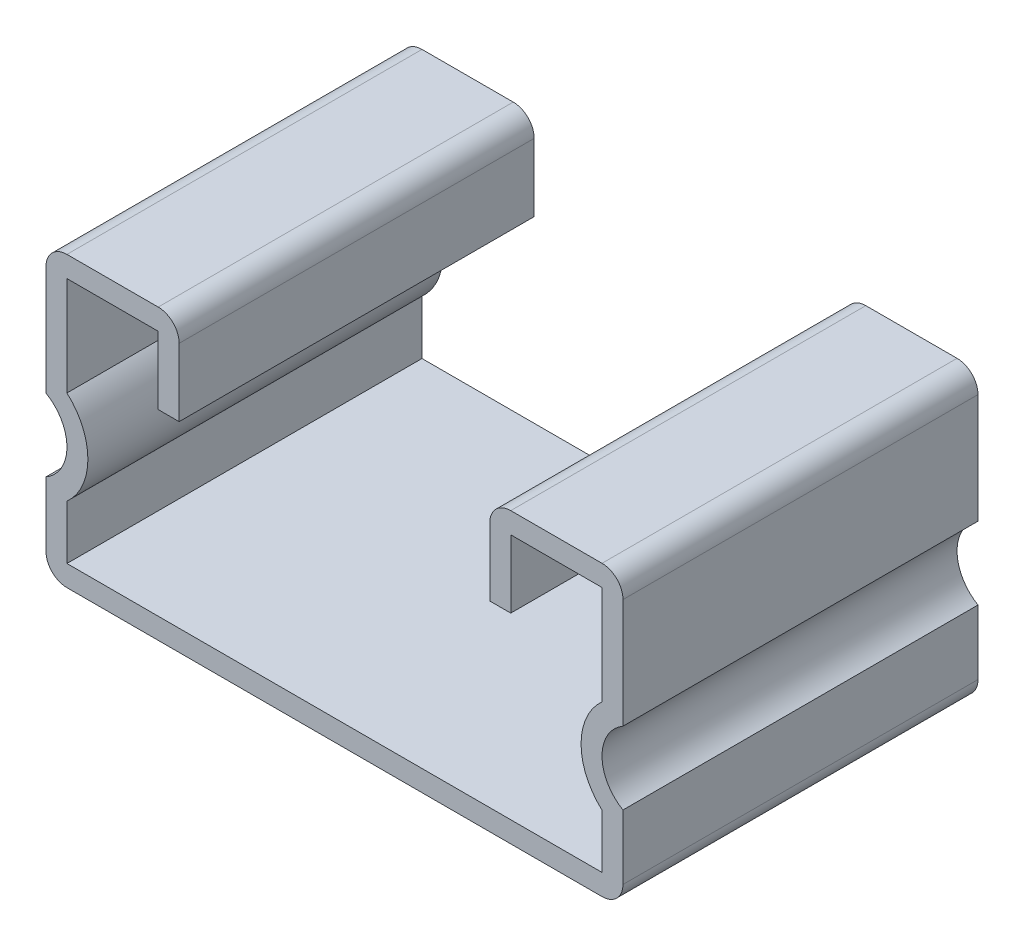
ISO-10303-21;
HEADER;
FILE_DESCRIPTION(('STEP AP214'),'2;1');
FILE_NAME('part.step','',(''),(''),'','','');
FILE_SCHEMA(('AUTOMOTIVE_DESIGN { 1 0 10303 214 1 1 1 1 }'));
ENDSEC;
DATA;
#1=APPLICATION_CONTEXT('core data for automotive mechanical design processes');
#2=APPLICATION_PROTOCOL_DEFINITION('international standard','automotive_design',2000,#1);
#3=PRODUCT_CONTEXT('',#1,'mechanical');
#4=PRODUCT('Part','Part','',(#3));
#5=PRODUCT_RELATED_PRODUCT_CATEGORY('part','',(#4));
#6=PRODUCT_DEFINITION_FORMATION('','',#4);
#7=PRODUCT_DEFINITION_CONTEXT('part definition',#1,'design');
#8=PRODUCT_DEFINITION('design','',#6,#7);
#9=PRODUCT_DEFINITION_SHAPE('','',#8);
#10=(LENGTH_UNIT() NAMED_UNIT(*) SI_UNIT(.MILLI.,.METRE.));
#11=(NAMED_UNIT(*) PLANE_ANGLE_UNIT() SI_UNIT($,.RADIAN.));
#12=(NAMED_UNIT(*) SI_UNIT($,.STERADIAN.) SOLID_ANGLE_UNIT());
#13=UNCERTAINTY_MEASURE_WITH_UNIT(LENGTH_MEASURE(1.E-05),#10,'distance_accuracy_value','');
#14=(GEOMETRIC_REPRESENTATION_CONTEXT(3) GLOBAL_UNCERTAINTY_ASSIGNED_CONTEXT((#13)) GLOBAL_UNIT_ASSIGNED_CONTEXT((#10,
#11,#12)) REPRESENTATION_CONTEXT('',''));
#15=CARTESIAN_POINT('',(0.,0.,0.));
#16=DIRECTION('',(0.,0.,1.));
#17=DIRECTION('',(1.,0.,0.));
#18=AXIS2_PLACEMENT_3D('',#15,#16,#17);
#19=CARTESIAN_POINT('',(-19.1389,10.4394,12.7));
#20=DIRECTION('',(-1.,0.,0.));
#21=DIRECTION('',(0.,0.,1.));
#22=AXIS2_PLACEMENT_3D('',#19,#20,#21);
#23=PLANE('',#22);
#24=DIRECTION('',(0.,1.,0.));
#25=VECTOR('',#24,1.);
#26=CARTESIAN_POINT('',(-19.1389,10.4394,-12.7));
#27=LINE('',#26,#25);
#28=CARTESIAN_POINT('',(-19.1389,3.35097147108124,-12.7));
#29=VERTEX_POINT('',#28);
#30=CARTESIAN_POINT('',(-19.1389,10.4394,-12.7));
#31=VERTEX_POINT('',#30);
#32=EDGE_CURVE('E260',#29,#31,#27,.T.);
#33=ORIENTED_EDGE('',*,*,#32,.T.);
#34=DIRECTION('',(0.,0.,-1.));
#35=VECTOR('',#34,1.);
#36=CARTESIAN_POINT('',(-19.1389,10.4394,12.7));
#37=LINE('',#36,#35);
#38=CARTESIAN_POINT('',(-19.1389,10.4394,12.7));
#39=VERTEX_POINT('',#38);
#40=EDGE_CURVE('E11',#39,#31,#37,.T.);
#41=ORIENTED_EDGE('',*,*,#40,.F.);
#42=DIRECTION('',(0.,1.,0.));
#43=VECTOR('',#42,1.);
#44=CARTESIAN_POINT('',(-19.1389,10.4394,12.7));
#45=LINE('',#44,#43);
#46=CARTESIAN_POINT('',(-19.1389,3.35097147108124,12.7));
#47=VERTEX_POINT('',#46);
#48=EDGE_CURVE('E318',#47,#39,#45,.T.);
#49=ORIENTED_EDGE('',*,*,#48,.F.);
#50=DIRECTION('',(0.,0.,-1.));
#51=VECTOR('',#50,1.);
#52=CARTESIAN_POINT('',(-19.1389,3.35097147108124,12.7));
#53=LINE('',#52,#51);
#54=EDGE_CURVE('E256',#47,#29,#53,.T.);
#55=ORIENTED_EDGE('',*,*,#54,.T.);
#56=EDGE_LOOP('',(#33,#41,#49,#55));
#57=FACE_BOUND('',#56,.T.);
#58=ADVANCED_FACE('F32',(#57),#23,.F.);
#59=CARTESIAN_POINT('',(-19.1389,10.4394,12.7));
#60=DIRECTION('',(0.,1.,0.));
#61=DIRECTION('',(-1.,0.,0.));
#62=AXIS2_PLACEMENT_3D('',#59,#60,#61);
#63=PLANE('',#62);
#64=DIRECTION('',(1.,0.,0.));
#65=VECTOR('',#64,1.);
#66=CARTESIAN_POINT('',(-19.1389,10.4394,-12.7));
#67=LINE('',#66,#65);
#68=CARTESIAN_POINT('',(-12.6111,10.4394,-12.7));
#69=VERTEX_POINT('',#68);
#70=EDGE_CURVE('E263',#31,#69,#67,.T.);
#71=ORIENTED_EDGE('',*,*,#70,.T.);
#72=DIRECTION('',(0.,0.,-1.));
#73=VECTOR('',#72,1.);
#74=CARTESIAN_POINT('',(-12.6111,10.4394,12.7));
#75=LINE('',#74,#73);
#76=CARTESIAN_POINT('',(-12.6111,10.4394,12.7));
#77=VERTEX_POINT('',#76);
#78=EDGE_CURVE('E40',#77,#69,#75,.T.);
#79=ORIENTED_EDGE('',*,*,#78,.F.);
#80=DIRECTION('',(1.,0.,0.));
#81=VECTOR('',#80,1.);
#82=CARTESIAN_POINT('',(-19.1389,10.4394,12.7));
#83=LINE('',#82,#81);
#84=EDGE_CURVE('E157',#39,#77,#83,.T.);
#85=ORIENTED_EDGE('',*,*,#84,.F.);
#86=ORIENTED_EDGE('',*,*,#40,.T.);
#87=EDGE_LOOP('',(#71,#79,#85,#86));
#88=FACE_BOUND('',#87,.T.);
#89=ADVANCED_FACE('F486',(#88),#63,.F.);
#90=CARTESIAN_POINT('',(-12.6111,10.4394,12.7));
#91=DIRECTION('',(1.,0.,0.));
#92=DIRECTION('',(0.,0.,-1.));
#93=AXIS2_PLACEMENT_3D('',#90,#91,#92);
#94=PLANE('',#93);
#95=DIRECTION('',(0.,-1.,0.));
#96=VECTOR('',#95,1.);
#97=CARTESIAN_POINT('',(-12.6111,10.4394,-12.7));
#98=LINE('',#97,#96);
#99=CARTESIAN_POINT('',(-12.6111,5.588,-12.7));
#100=VERTEX_POINT('',#99);
#101=EDGE_CURVE('E265',#69,#100,#98,.T.);
#102=ORIENTED_EDGE('',*,*,#101,.T.);
#103=DIRECTION('',(0.,0.,-1.));
#104=VECTOR('',#103,1.);
#105=CARTESIAN_POINT('',(-12.6111,5.588,12.7));
#106=LINE('',#105,#104);
#107=CARTESIAN_POINT('',(-12.6111,5.588,12.7));
#108=VERTEX_POINT('',#107);
#109=EDGE_CURVE('E391',#108,#100,#106,.T.);
#110=ORIENTED_EDGE('',*,*,#109,.F.);
#111=DIRECTION('',(0.,-1.,0.));
#112=VECTOR('',#111,1.);
#113=CARTESIAN_POINT('',(-12.6111,10.4394,12.7));
#114=LINE('',#113,#112);
#115=EDGE_CURVE('E399',#77,#108,#114,.T.);
#116=ORIENTED_EDGE('',*,*,#115,.F.);
#117=ORIENTED_EDGE('',*,*,#78,.T.);
#118=EDGE_LOOP('',(#102,#110,#116,#117));
#119=FACE_BOUND('',#118,.T.);
#120=ADVANCED_FACE('F397',(#119),#94,.F.);
#121=CARTESIAN_POINT('',(-12.6111,5.588,12.7));
#122=DIRECTION('',(0.,1.,0.));
#123=DIRECTION('',(0.,0.,1.));
#124=AXIS2_PLACEMENT_3D('',#121,#122,#123);
#125=PLANE('',#124);
#126=DIRECTION('',(1.,0.,0.));
#127=VECTOR('',#126,1.);
#128=CARTESIAN_POINT('',(-12.6111,5.588,-12.7));
#129=LINE('',#128,#127);
#130=CARTESIAN_POINT('',(-11.1125,5.588,-12.7));
#131=VERTEX_POINT('',#130);
#132=EDGE_CURVE('E267',#100,#131,#129,.T.);
#133=ORIENTED_EDGE('',*,*,#132,.T.);
#134=DIRECTION('',(0.,0.,-1.));
#135=VECTOR('',#134,1.);
#136=CARTESIAN_POINT('',(-11.1125,5.588,12.7));
#137=LINE('',#136,#135);
#138=CARTESIAN_POINT('',(-11.1125,5.588,12.7));
#139=VERTEX_POINT('',#138);
#140=EDGE_CURVE('E388',#139,#131,#137,.T.);
#141=ORIENTED_EDGE('',*,*,#140,.F.);
#142=DIRECTION('',(1.,0.,0.));
#143=VECTOR('',#142,1.);
#144=CARTESIAN_POINT('',(-12.6111,5.588,12.7));
#145=LINE('',#144,#143);
#146=EDGE_CURVE('E417',#108,#139,#145,.T.);
#147=ORIENTED_EDGE('',*,*,#146,.F.);
#148=ORIENTED_EDGE('',*,*,#109,.T.);
#149=EDGE_LOOP('',(#133,#141,#147,#148));
#150=FACE_BOUND('',#149,.T.);
#151=ADVANCED_FACE('F408',(#150),#125,.F.);
#152=CARTESIAN_POINT('',(-11.1125,10.4394,12.7));
#153=DIRECTION('',(-1.,0.,0.));
#154=DIRECTION('',(0.,-1.,0.));
#155=AXIS2_PLACEMENT_3D('',#152,#153,#154);
#156=PLANE('',#155);
#157=DIRECTION('',(0.,1.,0.));
#158=VECTOR('',#157,1.);
#159=CARTESIAN_POINT('',(-11.1125,10.4394,-12.7));
#160=LINE('',#159,#158);
#161=CARTESIAN_POINT('',(-11.1125,10.4394,-12.7));
#162=VERTEX_POINT('',#161);
#163=EDGE_CURVE('E269',#131,#162,#160,.T.);
#164=ORIENTED_EDGE('',*,*,#163,.T.);
#165=DIRECTION('',(0.,0.,-1.));
#166=VECTOR('',#165,1.);
#167=CARTESIAN_POINT('',(-11.1125,10.4394,12.7));
#168=LINE('',#167,#166);
#169=CARTESIAN_POINT('',(-11.1125,10.4394,12.7));
#170=VERTEX_POINT('',#169);
#171=EDGE_CURVE('E385',#170,#162,#168,.T.);
#172=ORIENTED_EDGE('',*,*,#171,.F.);
#173=DIRECTION('',(0.,1.,0.));
#174=VECTOR('',#173,1.);
#175=CARTESIAN_POINT('',(-11.1125,10.4394,12.7));
#176=LINE('',#175,#174);
#177=EDGE_CURVE('E414',#139,#170,#176,.T.);
#178=ORIENTED_EDGE('',*,*,#177,.F.);
#179=ORIENTED_EDGE('',*,*,#140,.T.);
#180=EDGE_LOOP('',(#164,#172,#178,#179));
#181=FACE_BOUND('',#180,.T.);
#182=ADVANCED_FACE('F412',(#181),#156,.F.);
#183=CARTESIAN_POINT('',(-12.6111,10.4394,12.7));
#184=DIRECTION('',(0.,0.,-1.));
#185=DIRECTION('',(-1.,0.,0.));
#186=AXIS2_PLACEMENT_3D('',#183,#184,#185);
#187=CYLINDRICAL_SURFACE('',#186,1.4986);
#188=CARTESIAN_POINT('',(-12.6111,10.4394,-12.7));
#189=DIRECTION('',(0.,0.,1.));
#190=DIRECTION('',(-1.,0.,0.));
#191=AXIS2_PLACEMENT_3D('',#188,#189,#190);
#192=CIRCLE('',#191,1.4986);
#193=CARTESIAN_POINT('',(-12.6111,11.938,-12.7));
#194=VERTEX_POINT('',#193);
#195=EDGE_CURVE('E271',#162,#194,#192,.T.);
#196=ORIENTED_EDGE('',*,*,#195,.T.);
#197=DIRECTION('',(0.,0.,-1.));
#198=VECTOR('',#197,1.);
#199=CARTESIAN_POINT('',(-12.6111,11.938,12.7));
#200=LINE('',#199,#198);
#201=CARTESIAN_POINT('',(-12.6111,11.938,12.7));
#202=VERTEX_POINT('',#201);
#203=EDGE_CURVE('E382',#202,#194,#200,.T.);
#204=ORIENTED_EDGE('',*,*,#203,.F.);
#205=CARTESIAN_POINT('',(-12.6111,10.4394,12.7));
#206=DIRECTION('',(0.,0.,1.));
#207=DIRECTION('',(-1.,0.,0.));
#208=AXIS2_PLACEMENT_3D('',#205,#206,#207);
#209=CIRCLE('',#208,1.4986);
#210=EDGE_CURVE('E416',#170,#202,#209,.T.);
#211=ORIENTED_EDGE('',*,*,#210,.F.);
#212=ORIENTED_EDGE('',*,*,#171,.T.);
#213=EDGE_LOOP('',(#196,#204,#211,#212));
#214=FACE_BOUND('',#213,.T.);
#215=ADVANCED_FACE('F499',(#214),#187,.T.);
#216=CARTESIAN_POINT('',(-19.1389,11.938,12.7));
#217=DIRECTION('',(0.,-1.,0.));
#218=DIRECTION('',(0.,0.,-1.));
#219=AXIS2_PLACEMENT_3D('',#216,#217,#218);
#220=PLANE('',#219);
#221=DIRECTION('',(-1.,0.,0.));
#222=VECTOR('',#221,1.);
#223=CARTESIAN_POINT('',(-19.1389,11.938,-12.7));
#224=LINE('',#223,#222);
#225=CARTESIAN_POINT('',(-19.1389,11.938,-12.7));
#226=VERTEX_POINT('',#225);
#227=EDGE_CURVE('E273',#194,#226,#224,.T.);
#228=ORIENTED_EDGE('',*,*,#227,.T.);
#229=DIRECTION('',(0.,0.,-1.));
#230=VECTOR('',#229,1.);
#231=CARTESIAN_POINT('',(-19.1389,11.938,12.7));
#232=LINE('',#231,#230);
#233=CARTESIAN_POINT('',(-19.1389,11.938,12.7));
#234=VERTEX_POINT('',#233);
#235=EDGE_CURVE('E379',#234,#226,#232,.T.);
#236=ORIENTED_EDGE('',*,*,#235,.F.);
#237=DIRECTION('',(-1.,0.,0.));
#238=VECTOR('',#237,1.);
#239=CARTESIAN_POINT('',(-19.1389,11.938,12.7));
#240=LINE('',#239,#238);
#241=EDGE_CURVE('E419',#202,#234,#240,.T.);
#242=ORIENTED_EDGE('',*,*,#241,.F.);
#243=ORIENTED_EDGE('',*,*,#203,.T.);
#244=EDGE_LOOP('',(#228,#236,#242,#243));
#245=FACE_BOUND('',#244,.T.);
#246=ADVANCED_FACE('F502',(#245),#220,.F.);
#247=CARTESIAN_POINT('',(-19.1389,10.4394,12.7));
#248=DIRECTION('',(0.,0.,-1.));
#249=DIRECTION('',(-1.,0.,0.));
#250=AXIS2_PLACEMENT_3D('',#247,#248,#249);
#251=CYLINDRICAL_SURFACE('',#250,1.49860000000002);
#252=CARTESIAN_POINT('',(-19.1389,10.4394,-12.7));
#253=DIRECTION('',(0.,0.,1.));
#254=DIRECTION('',(-1.,0.,0.));
#255=AXIS2_PLACEMENT_3D('',#252,#253,#254);
#256=CIRCLE('',#255,1.49860000000002);
#257=CARTESIAN_POINT('',(-20.6375,10.4394,-12.7));
#258=VERTEX_POINT('',#257);
#259=EDGE_CURVE('E275',#226,#258,#256,.T.);
#260=ORIENTED_EDGE('',*,*,#259,.T.);
#261=DIRECTION('',(0.,0.,-1.));
#262=VECTOR('',#261,1.);
#263=CARTESIAN_POINT('',(-20.6375,10.4394,12.7));
#264=LINE('',#263,#262);
#265=CARTESIAN_POINT('',(-20.6375,10.4394,12.7));
#266=VERTEX_POINT('',#265);
#267=EDGE_CURVE('E376',#266,#258,#264,.T.);
#268=ORIENTED_EDGE('',*,*,#267,.F.);
#269=CARTESIAN_POINT('',(-19.1389,10.4394,12.7));
#270=DIRECTION('',(0.,0.,1.));
#271=DIRECTION('',(-1.,0.,0.));
#272=AXIS2_PLACEMENT_3D('',#269,#270,#271);
#273=CIRCLE('',#272,1.49860000000002);
#274=EDGE_CURVE('E425',#234,#266,#273,.T.);
#275=ORIENTED_EDGE('',*,*,#274,.F.);
#276=ORIENTED_EDGE('',*,*,#235,.T.);
#277=EDGE_LOOP('',(#260,#268,#275,#276));
#278=FACE_BOUND('',#277,.T.);
#279=ADVANCED_FACE('F506',(#278),#251,.T.);
#280=CARTESIAN_POINT('',(-20.6375,10.4394,12.7));
#281=DIRECTION('',(1.,0.,0.));
#282=DIRECTION('',(0.,1.,0.));
#283=AXIS2_PLACEMENT_3D('',#280,#281,#282);
#284=PLANE('',#283);
#285=DIRECTION('',(0.,-1.,0.));
#286=VECTOR('',#285,1.);
#287=CARTESIAN_POINT('',(-20.6375,10.4394,-12.7));
#288=LINE('',#287,#286);
#289=CARTESIAN_POINT('',(-20.6375,2.59565134022272,-12.7));
#290=VERTEX_POINT('',#289);
#291=EDGE_CURVE('E277',#258,#290,#288,.T.);
#292=ORIENTED_EDGE('',*,*,#291,.T.);
#293=DIRECTION('',(0.,0.,-1.));
#294=VECTOR('',#293,1.);
#295=CARTESIAN_POINT('',(-20.6375,2.59565134022272,12.7));
#296=LINE('',#295,#294);
#297=CARTESIAN_POINT('',(-20.6375,2.59565134022272,12.7));
#298=VERTEX_POINT('',#297);
#299=EDGE_CURVE('E373',#298,#290,#296,.T.);
#300=ORIENTED_EDGE('',*,*,#299,.F.);
#301=DIRECTION('',(0.,-1.,0.));
#302=VECTOR('',#301,1.);
#303=CARTESIAN_POINT('',(-20.6375,10.4394,12.7));
#304=LINE('',#303,#302);
#305=EDGE_CURVE('E427',#266,#298,#304,.T.);
#306=ORIENTED_EDGE('',*,*,#305,.F.);
#307=ORIENTED_EDGE('',*,*,#267,.T.);
#308=EDGE_LOOP('',(#292,#300,#306,#307));
#309=FACE_BOUND('',#308,.T.);
#310=ADVANCED_FACE('F510',(#309),#284,.F.);
#311=CARTESIAN_POINT('',(-22.1361,0.,12.7));
#312=DIRECTION('',(0.,0.,-1.));
#313=DIRECTION('',(-1.,0.,0.));
#314=AXIS2_PLACEMENT_3D('',#311,#312,#313);
#315=CYLINDRICAL_SURFACE('',#314,2.9972);
#316=CARTESIAN_POINT('',(-22.1361,0.,-12.7));
#317=DIRECTION('',(0.,0.,-1.));
#318=DIRECTION('',(1.,0.,0.));
#319=AXIS2_PLACEMENT_3D('',#316,#317,#318);
#320=CIRCLE('',#319,2.9972);
#321=CARTESIAN_POINT('',(-20.6375,-2.59565134022272,-12.7));
#322=VERTEX_POINT('',#321);
#323=EDGE_CURVE('E279',#290,#322,#320,.T.);
#324=ORIENTED_EDGE('',*,*,#323,.T.);
#325=DIRECTION('',(0.,0.,-1.));
#326=VECTOR('',#325,1.);
#327=CARTESIAN_POINT('',(-20.6375,-2.59565134022272,12.7));
#328=LINE('',#327,#326);
#329=CARTESIAN_POINT('',(-20.6375,-2.59565134022272,12.7));
#330=VERTEX_POINT('',#329);
#331=EDGE_CURVE('E370',#330,#322,#328,.T.);
#332=ORIENTED_EDGE('',*,*,#331,.F.);
#333=CARTESIAN_POINT('',(-22.1361,0.,12.7));
#334=DIRECTION('',(0.,0.,-1.));
#335=DIRECTION('',(1.,0.,0.));
#336=AXIS2_PLACEMENT_3D('',#333,#334,#335);
#337=CIRCLE('',#336,2.9972);
#338=EDGE_CURVE('E429',#298,#330,#337,.T.);
#339=ORIENTED_EDGE('',*,*,#338,.F.);
#340=ORIENTED_EDGE('',*,*,#299,.T.);
#341=EDGE_LOOP('',(#324,#332,#339,#340));
#342=FACE_BOUND('',#341,.T.);
#343=ADVANCED_FACE('F514',(#342),#315,.F.);
#344=CARTESIAN_POINT('',(-20.6375,-2.59565134022272,12.7));
#345=DIRECTION('',(1.,0.,0.));
#346=DIRECTION('',(0.,1.,0.));
#347=AXIS2_PLACEMENT_3D('',#344,#345,#346);
#348=PLANE('',#347);
#349=DIRECTION('',(0.,-1.,0.));
#350=VECTOR('',#349,1.);
#351=CARTESIAN_POINT('',(-20.6375,-2.59565134022272,-12.7));
#352=LINE('',#351,#350);
#353=CARTESIAN_POINT('',(-20.6375,-7.2136,-12.7));
#354=VERTEX_POINT('',#353);
#355=EDGE_CURVE('E281',#322,#354,#352,.T.);
#356=ORIENTED_EDGE('',*,*,#355,.T.);
#357=DIRECTION('',(0.,0.,-1.));
#358=VECTOR('',#357,1.);
#359=CARTESIAN_POINT('',(-20.6375,-7.2136,12.7));
#360=LINE('',#359,#358);
#361=CARTESIAN_POINT('',(-20.6375,-7.2136,12.7));
#362=VERTEX_POINT('',#361);
#363=EDGE_CURVE('E367',#362,#354,#360,.T.);
#364=ORIENTED_EDGE('',*,*,#363,.F.);
#365=DIRECTION('',(0.,-1.,0.));
#366=VECTOR('',#365,1.);
#367=CARTESIAN_POINT('',(-20.6375,-2.59565134022272,12.7));
#368=LINE('',#367,#366);
#369=EDGE_CURVE('E431',#330,#362,#368,.T.);
#370=ORIENTED_EDGE('',*,*,#369,.F.);
#371=ORIENTED_EDGE('',*,*,#331,.T.);
#372=EDGE_LOOP('',(#356,#364,#370,#371));
#373=FACE_BOUND('',#372,.T.);
#374=ADVANCED_FACE('F518',(#373),#348,.F.);
#375=CARTESIAN_POINT('',(-19.1389,-7.2136,12.7));
#376=DIRECTION('',(0.,0.,-1.));
#377=DIRECTION('',(-1.,0.,0.));
#378=AXIS2_PLACEMENT_3D('',#375,#376,#377);
#379=CYLINDRICAL_SURFACE('',#378,1.4986);
#380=CARTESIAN_POINT('',(-19.1389,-7.2136,-12.7));
#381=DIRECTION('',(0.,0.,1.));
#382=DIRECTION('',(-1.,0.,0.));
#383=AXIS2_PLACEMENT_3D('',#380,#381,#382);
#384=CIRCLE('',#383,1.4986);
#385=CARTESIAN_POINT('',(-19.1389,-8.7122,-12.7));
#386=VERTEX_POINT('',#385);
#387=EDGE_CURVE('E283',#354,#386,#384,.T.);
#388=ORIENTED_EDGE('',*,*,#387,.T.);
#389=DIRECTION('',(0.,0.,-1.));
#390=VECTOR('',#389,1.);
#391=CARTESIAN_POINT('',(-19.1389,-8.7122,12.7));
#392=LINE('',#391,#390);
#393=CARTESIAN_POINT('',(-19.1389,-8.7122,12.7));
#394=VERTEX_POINT('',#393);
#395=EDGE_CURVE('E364',#394,#386,#392,.T.);
#396=ORIENTED_EDGE('',*,*,#395,.F.);
#397=CARTESIAN_POINT('',(-19.1389,-7.2136,12.7));
#398=DIRECTION('',(0.,0.,1.));
#399=DIRECTION('',(-1.,0.,0.));
#400=AXIS2_PLACEMENT_3D('',#397,#398,#399);
#401=CIRCLE('',#400,1.4986);
#402=EDGE_CURVE('E433',#362,#394,#401,.T.);
#403=ORIENTED_EDGE('',*,*,#402,.F.);
#404=ORIENTED_EDGE('',*,*,#363,.T.);
#405=EDGE_LOOP('',(#388,#396,#403,#404));
#406=FACE_BOUND('',#405,.T.);
#407=ADVANCED_FACE('F522',(#406),#379,.T.);
#408=CARTESIAN_POINT('',(-19.1389,-8.7122,12.7));
#409=DIRECTION('',(0.,1.,0.));
#410=DIRECTION('',(0.,0.,1.));
#411=AXIS2_PLACEMENT_3D('',#408,#409,#410);
#412=PLANE('',#411);
#413=DIRECTION('',(1.,0.,0.));
#414=VECTOR('',#413,1.);
#415=CARTESIAN_POINT('',(-19.1389,-8.7122,-12.7));
#416=LINE('',#415,#414);
#417=CARTESIAN_POINT('',(19.1389,-8.7122,-12.7));
#418=VERTEX_POINT('',#417);
#419=EDGE_CURVE('E285',#386,#418,#416,.T.);
#420=ORIENTED_EDGE('',*,*,#419,.T.);
#421=DIRECTION('',(0.,0.,-1.));
#422=VECTOR('',#421,1.);
#423=CARTESIAN_POINT('',(19.1389,-8.7122,12.7));
#424=LINE('',#423,#422);
#425=CARTESIAN_POINT('',(19.1389,-8.7122,12.7));
#426=VERTEX_POINT('',#425);
#427=EDGE_CURVE('E361',#426,#418,#424,.T.);
#428=ORIENTED_EDGE('',*,*,#427,.F.);
#429=DIRECTION('',(1.,0.,0.));
#430=VECTOR('',#429,1.);
#431=CARTESIAN_POINT('',(-19.1389,-8.7122,12.7));
#432=LINE('',#431,#430);
#433=EDGE_CURVE('E435',#394,#426,#432,.T.);
#434=ORIENTED_EDGE('',*,*,#433,.F.);
#435=ORIENTED_EDGE('',*,*,#395,.T.);
#436=EDGE_LOOP('',(#420,#428,#434,#435));
#437=FACE_BOUND('',#436,.T.);
#438=ADVANCED_FACE('F526',(#437),#412,.F.);
#439=CARTESIAN_POINT('',(19.1389,-7.2136,12.7));
#440=DIRECTION('',(0.,0.,-1.));
#441=DIRECTION('',(-1.,0.,0.));
#442=AXIS2_PLACEMENT_3D('',#439,#440,#441);
#443=CYLINDRICAL_SURFACE('',#442,1.4986);
#444=CARTESIAN_POINT('',(19.1389,-7.2136,-12.7));
#445=DIRECTION('',(0.,0.,1.));
#446=DIRECTION('',(-1.,0.,0.));
#447=AXIS2_PLACEMENT_3D('',#444,#445,#446);
#448=CIRCLE('',#447,1.4986);
#449=CARTESIAN_POINT('',(20.6375,-7.2136,-12.7));
#450=VERTEX_POINT('',#449);
#451=EDGE_CURVE('E287',#418,#450,#448,.T.);
#452=ORIENTED_EDGE('',*,*,#451,.T.);
#453=DIRECTION('',(0.,0.,-1.));
#454=VECTOR('',#453,1.);
#455=CARTESIAN_POINT('',(20.6375,-7.2136,12.7));
#456=LINE('',#455,#454);
#457=CARTESIAN_POINT('',(20.6375,-7.2136,12.7));
#458=VERTEX_POINT('',#457);
#459=EDGE_CURVE('E358',#458,#450,#456,.T.);
#460=ORIENTED_EDGE('',*,*,#459,.F.);
#461=CARTESIAN_POINT('',(19.1389,-7.2136,12.7));
#462=DIRECTION('',(0.,0.,1.));
#463=DIRECTION('',(-1.,0.,0.));
#464=AXIS2_PLACEMENT_3D('',#461,#462,#463);
#465=CIRCLE('',#464,1.4986);
#466=EDGE_CURVE('E437',#426,#458,#465,.T.);
#467=ORIENTED_EDGE('',*,*,#466,.F.);
#468=ORIENTED_EDGE('',*,*,#427,.T.);
#469=EDGE_LOOP('',(#452,#460,#467,#468));
#470=FACE_BOUND('',#469,.T.);
#471=ADVANCED_FACE('F530',(#470),#443,.T.);
#472=CARTESIAN_POINT('',(20.6375,-7.2136,12.7));
#473=DIRECTION('',(-1.,0.,0.));
#474=DIRECTION('',(0.,0.,1.));
#475=AXIS2_PLACEMENT_3D('',#472,#473,#474);
#476=PLANE('',#475);
#477=DIRECTION('',(0.,1.,0.));
#478=VECTOR('',#477,1.);
#479=CARTESIAN_POINT('',(20.6375,-7.2136,-12.7));
#480=LINE('',#479,#478);
#481=CARTESIAN_POINT('',(20.6375,-2.59565134022272,-12.7));
#482=VERTEX_POINT('',#481);
#483=EDGE_CURVE('E289',#450,#482,#480,.T.);
#484=ORIENTED_EDGE('',*,*,#483,.T.);
#485=DIRECTION('',(0.,0.,-1.));
#486=VECTOR('',#485,1.);
#487=CARTESIAN_POINT('',(20.6375,-2.59565134022272,12.7));
#488=LINE('',#487,#486);
#489=CARTESIAN_POINT('',(20.6375,-2.59565134022272,12.7));
#490=VERTEX_POINT('',#489);
#491=EDGE_CURVE('E355',#490,#482,#488,.T.);
#492=ORIENTED_EDGE('',*,*,#491,.F.);
#493=DIRECTION('',(0.,1.,0.));
#494=VECTOR('',#493,1.);
#495=CARTESIAN_POINT('',(20.6375,-7.2136,12.7));
#496=LINE('',#495,#494);
#497=EDGE_CURVE('E439',#458,#490,#496,.T.);
#498=ORIENTED_EDGE('',*,*,#497,.F.);
#499=ORIENTED_EDGE('',*,*,#459,.T.);
#500=EDGE_LOOP('',(#484,#492,#498,#499));
#501=FACE_BOUND('',#500,.T.);
#502=ADVANCED_FACE('F534',(#501),#476,.F.);
#503=CARTESIAN_POINT('',(22.1361,0.,12.7));
#504=DIRECTION('',(0.,0.,-1.));
#505=DIRECTION('',(-1.,0.,0.));
#506=AXIS2_PLACEMENT_3D('',#503,#504,#505);
#507=CYLINDRICAL_SURFACE('',#506,2.9972);
#508=CARTESIAN_POINT('',(22.1361,0.,-12.7));
#509=DIRECTION('',(0.,0.,-1.));
#510=DIRECTION('',(1.,0.,0.));
#511=AXIS2_PLACEMENT_3D('',#508,#509,#510);
#512=CIRCLE('',#511,2.9972);
#513=CARTESIAN_POINT('',(20.6375,2.59565134022272,-12.7));
#514=VERTEX_POINT('',#513);
#515=EDGE_CURVE('E291',#482,#514,#512,.T.);
#516=ORIENTED_EDGE('',*,*,#515,.T.);
#517=DIRECTION('',(0.,0.,-1.));
#518=VECTOR('',#517,1.);
#519=CARTESIAN_POINT('',(20.6375,2.59565134022272,12.7));
#520=LINE('',#519,#518);
#521=CARTESIAN_POINT('',(20.6375,2.59565134022272,12.7));
#522=VERTEX_POINT('',#521);
#523=EDGE_CURVE('E352',#522,#514,#520,.T.);
#524=ORIENTED_EDGE('',*,*,#523,.F.);
#525=CARTESIAN_POINT('',(22.1361,0.,12.7));
#526=DIRECTION('',(0.,0.,-1.));
#527=DIRECTION('',(1.,0.,0.));
#528=AXIS2_PLACEMENT_3D('',#525,#526,#527);
#529=CIRCLE('',#528,2.9972);
#530=EDGE_CURVE('E441',#490,#522,#529,.T.);
#531=ORIENTED_EDGE('',*,*,#530,.F.);
#532=ORIENTED_EDGE('',*,*,#491,.T.);
#533=EDGE_LOOP('',(#516,#524,#531,#532));
#534=FACE_BOUND('',#533,.T.);
#535=ADVANCED_FACE('F538',(#534),#507,.F.);
#536=CARTESIAN_POINT('',(20.6375,2.59565134022272,12.7));
#537=DIRECTION('',(-1.,0.,0.));
#538=DIRECTION('',(0.,-1.,0.));
#539=AXIS2_PLACEMENT_3D('',#536,#537,#538);
#540=PLANE('',#539);
#541=DIRECTION('',(0.,1.,0.));
#542=VECTOR('',#541,1.);
#543=CARTESIAN_POINT('',(20.6375,2.59565134022272,-12.7));
#544=LINE('',#543,#542);
#545=CARTESIAN_POINT('',(20.6375,10.4394,-12.7));
#546=VERTEX_POINT('',#545);
#547=EDGE_CURVE('E293',#514,#546,#544,.T.);
#548=ORIENTED_EDGE('',*,*,#547,.T.);
#549=DIRECTION('',(0.,0.,-1.));
#550=VECTOR('',#549,1.);
#551=CARTESIAN_POINT('',(20.6375,10.4394,12.7));
#552=LINE('',#551,#550);
#553=CARTESIAN_POINT('',(20.6375,10.4394,12.7));
#554=VERTEX_POINT('',#553);
#555=EDGE_CURVE('E349',#554,#546,#552,.T.);
#556=ORIENTED_EDGE('',*,*,#555,.F.);
#557=DIRECTION('',(0.,1.,0.));
#558=VECTOR('',#557,1.);
#559=CARTESIAN_POINT('',(20.6375,2.59565134022272,12.7));
#560=LINE('',#559,#558);
#561=EDGE_CURVE('E443',#522,#554,#560,.T.);
#562=ORIENTED_EDGE('',*,*,#561,.F.);
#563=ORIENTED_EDGE('',*,*,#523,.T.);
#564=EDGE_LOOP('',(#548,#556,#562,#563));
#565=FACE_BOUND('',#564,.T.);
#566=ADVANCED_FACE('F542',(#565),#540,.F.);
#567=CARTESIAN_POINT('',(19.1389,10.4394,12.7));
#568=DIRECTION('',(0.,0.,-1.));
#569=DIRECTION('',(-1.,0.,0.));
#570=AXIS2_PLACEMENT_3D('',#567,#568,#569);
#571=CYLINDRICAL_SURFACE('',#570,1.4986);
#572=CARTESIAN_POINT('',(19.1389,10.4394,-12.7));
#573=DIRECTION('',(0.,0.,1.));
#574=DIRECTION('',(-1.,0.,0.));
#575=AXIS2_PLACEMENT_3D('',#572,#573,#574);
#576=CIRCLE('',#575,1.4986);
#577=CARTESIAN_POINT('',(19.1389,11.938,-12.7));
#578=VERTEX_POINT('',#577);
#579=EDGE_CURVE('E295',#546,#578,#576,.T.);
#580=ORIENTED_EDGE('',*,*,#579,.T.);
#581=DIRECTION('',(0.,0.,-1.));
#582=VECTOR('',#581,1.);
#583=CARTESIAN_POINT('',(19.1389,11.938,12.7));
#584=LINE('',#583,#582);
#585=CARTESIAN_POINT('',(19.1389,11.938,12.7));
#586=VERTEX_POINT('',#585);
#587=EDGE_CURVE('E346',#586,#578,#584,.T.);
#588=ORIENTED_EDGE('',*,*,#587,.F.);
#589=CARTESIAN_POINT('',(19.1389,10.4394,12.7));
#590=DIRECTION('',(0.,0.,1.));
#591=DIRECTION('',(-1.,0.,0.));
#592=AXIS2_PLACEMENT_3D('',#589,#590,#591);
#593=CIRCLE('',#592,1.4986);
#594=EDGE_CURVE('E445',#554,#586,#593,.T.);
#595=ORIENTED_EDGE('',*,*,#594,.F.);
#596=ORIENTED_EDGE('',*,*,#555,.T.);
#597=EDGE_LOOP('',(#580,#588,#595,#596));
#598=FACE_BOUND('',#597,.T.);
#599=ADVANCED_FACE('F546',(#598),#571,.T.);
#600=CARTESIAN_POINT('',(19.1389,11.938,12.7));
#601=DIRECTION('',(0.,-1.,0.));
#602=DIRECTION('',(1.,0.,0.));
#603=AXIS2_PLACEMENT_3D('',#600,#601,#602);
#604=PLANE('',#603);
#605=DIRECTION('',(-1.,0.,0.));
#606=VECTOR('',#605,1.);
#607=CARTESIAN_POINT('',(19.1389,11.938,-12.7));
#608=LINE('',#607,#606);
#609=CARTESIAN_POINT('',(12.6111,11.938,-12.7));
#610=VERTEX_POINT('',#609);
#611=EDGE_CURVE('E297',#578,#610,#608,.T.);
#612=ORIENTED_EDGE('',*,*,#611,.T.);
#613=DIRECTION('',(0.,0.,-1.));
#614=VECTOR('',#613,1.);
#615=CARTESIAN_POINT('',(12.6111,11.938,12.7));
#616=LINE('',#615,#614);
#617=CARTESIAN_POINT('',(12.6111,11.938,12.7));
#618=VERTEX_POINT('',#617);
#619=EDGE_CURVE('E343',#618,#610,#616,.T.);
#620=ORIENTED_EDGE('',*,*,#619,.F.);
#621=DIRECTION('',(-1.,0.,0.));
#622=VECTOR('',#621,1.);
#623=CARTESIAN_POINT('',(19.1389,11.938,12.7));
#624=LINE('',#623,#622);
#625=EDGE_CURVE('E447',#586,#618,#624,.T.);
#626=ORIENTED_EDGE('',*,*,#625,.F.);
#627=ORIENTED_EDGE('',*,*,#587,.T.);
#628=EDGE_LOOP('',(#612,#620,#626,#627));
#629=FACE_BOUND('',#628,.T.);
#630=ADVANCED_FACE('F550',(#629),#604,.F.);
#631=CARTESIAN_POINT('',(12.6111,10.4394,12.7));
#632=DIRECTION('',(0.,0.,-1.));
#633=DIRECTION('',(-1.,0.,0.));
#634=AXIS2_PLACEMENT_3D('',#631,#632,#633);
#635=CYLINDRICAL_SURFACE('',#634,1.4986);
#636=CARTESIAN_POINT('',(12.6111,10.4394,-12.7));
#637=DIRECTION('',(0.,0.,1.));
#638=DIRECTION('',(-1.,0.,0.));
#639=AXIS2_PLACEMENT_3D('',#636,#637,#638);
#640=CIRCLE('',#639,1.4986);
#641=CARTESIAN_POINT('',(11.1125,10.4394,-12.7));
#642=VERTEX_POINT('',#641);
#643=EDGE_CURVE('E299',#610,#642,#640,.T.);
#644=ORIENTED_EDGE('',*,*,#643,.T.);
#645=DIRECTION('',(0.,0.,-1.));
#646=VECTOR('',#645,1.);
#647=CARTESIAN_POINT('',(11.1125,10.4394,12.7));
#648=LINE('',#647,#646);
#649=CARTESIAN_POINT('',(11.1125,10.4394,12.7));
#650=VERTEX_POINT('',#649);
#651=EDGE_CURVE('E340',#650,#642,#648,.T.);
#652=ORIENTED_EDGE('',*,*,#651,.F.);
#653=CARTESIAN_POINT('',(12.6111,10.4394,12.7));
#654=DIRECTION('',(0.,0.,1.));
#655=DIRECTION('',(-1.,0.,0.));
#656=AXIS2_PLACEMENT_3D('',#653,#654,#655);
#657=CIRCLE('',#656,1.4986);
#658=EDGE_CURVE('E449',#618,#650,#657,.T.);
#659=ORIENTED_EDGE('',*,*,#658,.F.);
#660=ORIENTED_EDGE('',*,*,#619,.T.);
#661=EDGE_LOOP('',(#644,#652,#659,#660));
#662=FACE_BOUND('',#661,.T.);
#663=ADVANCED_FACE('F554',(#662),#635,.T.);
#664=CARTESIAN_POINT('',(11.1125,10.4394,12.7));
#665=DIRECTION('',(1.,0.,0.));
#666=DIRECTION('',(0.,0.,-1.));
#667=AXIS2_PLACEMENT_3D('',#664,#665,#666);
#668=PLANE('',#667);
#669=DIRECTION('',(0.,-1.,0.));
#670=VECTOR('',#669,1.);
#671=CARTESIAN_POINT('',(11.1125,10.4394,-12.7));
#672=LINE('',#671,#670);
#673=CARTESIAN_POINT('',(11.1125,5.588,-12.7));
#674=VERTEX_POINT('',#673);
#675=EDGE_CURVE('E301',#642,#674,#672,.T.);
#676=ORIENTED_EDGE('',*,*,#675,.T.);
#677=DIRECTION('',(0.,0.,-1.));
#678=VECTOR('',#677,1.);
#679=CARTESIAN_POINT('',(11.1125,5.588,12.7));
#680=LINE('',#679,#678);
#681=CARTESIAN_POINT('',(11.1125,5.588,12.7));
#682=VERTEX_POINT('',#681);
#683=EDGE_CURVE('E337',#682,#674,#680,.T.);
#684=ORIENTED_EDGE('',*,*,#683,.F.);
#685=DIRECTION('',(0.,-1.,0.));
#686=VECTOR('',#685,1.);
#687=CARTESIAN_POINT('',(11.1125,10.4394,12.7));
#688=LINE('',#687,#686);
#689=EDGE_CURVE('E451',#650,#682,#688,.T.);
#690=ORIENTED_EDGE('',*,*,#689,.F.);
#691=ORIENTED_EDGE('',*,*,#651,.T.);
#692=EDGE_LOOP('',(#676,#684,#690,#691));
#693=FACE_BOUND('',#692,.T.);
#694=ADVANCED_FACE('F558',(#693),#668,.F.);
#695=CARTESIAN_POINT('',(11.1125,5.588,12.7));
#696=DIRECTION('',(0.,1.,0.));
#697=DIRECTION('',(-1.,0.,0.));
#698=AXIS2_PLACEMENT_3D('',#695,#696,#697);
#699=PLANE('',#698);
#700=DIRECTION('',(1.,0.,0.));
#701=VECTOR('',#700,1.);
#702=CARTESIAN_POINT('',(11.1125,5.588,-12.7));
#703=LINE('',#702,#701);
#704=CARTESIAN_POINT('',(12.6111,5.588,-12.7));
#705=VERTEX_POINT('',#704);
#706=EDGE_CURVE('E303',#674,#705,#703,.T.);
#707=ORIENTED_EDGE('',*,*,#706,.T.);
#708=DIRECTION('',(0.,0.,-1.));
#709=VECTOR('',#708,1.);
#710=CARTESIAN_POINT('',(12.6111,5.588,12.7));
#711=LINE('',#710,#709);
#712=CARTESIAN_POINT('',(12.6111,5.588,12.7));
#713=VERTEX_POINT('',#712);
#714=EDGE_CURVE('E334',#713,#705,#711,.T.);
#715=ORIENTED_EDGE('',*,*,#714,.F.);
#716=DIRECTION('',(1.,0.,0.));
#717=VECTOR('',#716,1.);
#718=CARTESIAN_POINT('',(11.1125,5.588,12.7));
#719=LINE('',#718,#717);
#720=EDGE_CURVE('E453',#682,#713,#719,.T.);
#721=ORIENTED_EDGE('',*,*,#720,.F.);
#722=ORIENTED_EDGE('',*,*,#683,.T.);
#723=EDGE_LOOP('',(#707,#715,#721,#722));
#724=FACE_BOUND('',#723,.T.);
#725=ADVANCED_FACE('F562',(#724),#699,.F.);
#726=CARTESIAN_POINT('',(12.6111,10.4394,12.7));
#727=DIRECTION('',(-1.,0.,0.));
#728=DIRECTION('',(0.,0.,1.));
#729=AXIS2_PLACEMENT_3D('',#726,#727,#728);
#730=PLANE('',#729);
#731=DIRECTION('',(0.,1.,0.));
#732=VECTOR('',#731,1.);
#733=CARTESIAN_POINT('',(12.6111,10.4394,-12.7));
#734=LINE('',#733,#732);
#735=CARTESIAN_POINT('',(12.6111,10.4394,-12.7));
#736=VERTEX_POINT('',#735);
#737=EDGE_CURVE('E305',#705,#736,#734,.T.);
#738=ORIENTED_EDGE('',*,*,#737,.T.);
#739=DIRECTION('',(0.,0.,-1.));
#740=VECTOR('',#739,1.);
#741=CARTESIAN_POINT('',(12.6111,10.4394,12.7));
#742=LINE('',#741,#740);
#743=CARTESIAN_POINT('',(12.6111,10.4394,12.7));
#744=VERTEX_POINT('',#743);
#745=EDGE_CURVE('E331',#744,#736,#742,.T.);
#746=ORIENTED_EDGE('',*,*,#745,.F.);
#747=DIRECTION('',(0.,1.,0.));
#748=VECTOR('',#747,1.);
#749=CARTESIAN_POINT('',(12.6111,10.4394,12.7));
#750=LINE('',#749,#748);
#751=EDGE_CURVE('E455',#713,#744,#750,.T.);
#752=ORIENTED_EDGE('',*,*,#751,.F.);
#753=ORIENTED_EDGE('',*,*,#714,.T.);
#754=EDGE_LOOP('',(#738,#746,#752,#753));
#755=FACE_BOUND('',#754,.T.);
#756=ADVANCED_FACE('F566',(#755),#730,.F.);
#757=CARTESIAN_POINT('',(19.1389,10.4394,12.7));
#758=DIRECTION('',(0.,1.,0.));
#759=DIRECTION('',(-1.,0.,0.));
#760=AXIS2_PLACEMENT_3D('',#757,#758,#759);
#761=PLANE('',#760);
#762=DIRECTION('',(1.,0.,0.));
#763=VECTOR('',#762,1.);
#764=CARTESIAN_POINT('',(19.1389,10.4394,-12.7));
#765=LINE('',#764,#763);
#766=CARTESIAN_POINT('',(19.1389,10.4394,-12.7));
#767=VERTEX_POINT('',#766);
#768=EDGE_CURVE('E307',#736,#767,#765,.T.);
#769=ORIENTED_EDGE('',*,*,#768,.T.);
#770=DIRECTION('',(0.,0.,-1.));
#771=VECTOR('',#770,1.);
#772=CARTESIAN_POINT('',(19.1389,10.4394,12.7));
#773=LINE('',#772,#771);
#774=CARTESIAN_POINT('',(19.1389,10.4394,12.7));
#775=VERTEX_POINT('',#774);
#776=EDGE_CURVE('E328',#775,#767,#773,.T.);
#777=ORIENTED_EDGE('',*,*,#776,.F.);
#778=DIRECTION('',(1.,0.,0.));
#779=VECTOR('',#778,1.);
#780=CARTESIAN_POINT('',(19.1389,10.4394,12.7));
#781=LINE('',#780,#779);
#782=EDGE_CURVE('E457',#744,#775,#781,.T.);
#783=ORIENTED_EDGE('',*,*,#782,.F.);
#784=ORIENTED_EDGE('',*,*,#745,.T.);
#785=EDGE_LOOP('',(#769,#777,#783,#784));
#786=FACE_BOUND('',#785,.T.);
#787=ADVANCED_FACE('F570',(#786),#761,.F.);
#788=CARTESIAN_POINT('',(19.1389,3.35097147108124,12.7));
#789=DIRECTION('',(1.,0.,0.));
#790=DIRECTION('',(0.,1.,0.));
#791=AXIS2_PLACEMENT_3D('',#788,#789,#790);
#792=PLANE('',#791);
#793=DIRECTION('',(0.,-1.,0.));
#794=VECTOR('',#793,1.);
#795=CARTESIAN_POINT('',(19.1389,3.35097147108124,-12.7));
#796=LINE('',#795,#794);
#797=CARTESIAN_POINT('',(19.1389,3.35097147108124,-12.7));
#798=VERTEX_POINT('',#797);
#799=EDGE_CURVE('E309',#767,#798,#796,.T.);
#800=ORIENTED_EDGE('',*,*,#799,.T.);
#801=DIRECTION('',(0.,0.,-1.));
#802=VECTOR('',#801,1.);
#803=CARTESIAN_POINT('',(19.1389,3.35097147108124,12.7));
#804=LINE('',#803,#802);
#805=CARTESIAN_POINT('',(19.1389,3.35097147108124,12.7));
#806=VERTEX_POINT('',#805);
#807=EDGE_CURVE('E325',#806,#798,#804,.T.);
#808=ORIENTED_EDGE('',*,*,#807,.F.);
#809=DIRECTION('',(0.,-1.,0.));
#810=VECTOR('',#809,1.);
#811=CARTESIAN_POINT('',(19.1389,3.35097147108124,12.7));
#812=LINE('',#811,#810);
#813=EDGE_CURVE('E459',#775,#806,#812,.T.);
#814=ORIENTED_EDGE('',*,*,#813,.F.);
#815=ORIENTED_EDGE('',*,*,#776,.T.);
#816=EDGE_LOOP('',(#800,#808,#814,#815));
#817=FACE_BOUND('',#816,.T.);
#818=ADVANCED_FACE('F574',(#817),#792,.F.);
#819=CARTESIAN_POINT('',(22.1361,0.,12.7));
#820=DIRECTION('',(0.,0.,-1.));
#821=DIRECTION('',(-1.,0.,0.));
#822=AXIS2_PLACEMENT_3D('',#819,#820,#821);
#823=CYLINDRICAL_SURFACE('',#822,4.49580000000004);
#824=CARTESIAN_POINT('',(22.1361,0.,-12.7));
#825=DIRECTION('',(0.,0.,1.));
#826=DIRECTION('',(1.,0.,0.));
#827=AXIS2_PLACEMENT_3D('',#824,#825,#826);
#828=CIRCLE('',#827,4.49580000000004);
#829=CARTESIAN_POINT('',(19.1389,-3.35097147108123,-12.7));
#830=VERTEX_POINT('',#829);
#831=EDGE_CURVE('E311',#798,#830,#828,.T.);
#832=ORIENTED_EDGE('',*,*,#831,.T.);
#833=DIRECTION('',(0.,0.,-1.));
#834=VECTOR('',#833,1.);
#835=CARTESIAN_POINT('',(19.1389,-3.35097147108123,12.7));
#836=LINE('',#835,#834);
#837=CARTESIAN_POINT('',(19.1389,-3.35097147108123,12.7));
#838=VERTEX_POINT('',#837);
#839=EDGE_CURVE('E322',#838,#830,#836,.T.);
#840=ORIENTED_EDGE('',*,*,#839,.F.);
#841=CARTESIAN_POINT('',(22.1361,0.,12.7));
#842=DIRECTION('',(0.,0.,1.));
#843=DIRECTION('',(1.,0.,0.));
#844=AXIS2_PLACEMENT_3D('',#841,#842,#843);
#845=CIRCLE('',#844,4.49580000000004);
#846=EDGE_CURVE('E461',#806,#838,#845,.T.);
#847=ORIENTED_EDGE('',*,*,#846,.F.);
#848=ORIENTED_EDGE('',*,*,#807,.T.);
#849=EDGE_LOOP('',(#832,#840,#847,#848));
#850=FACE_BOUND('',#849,.T.);
#851=ADVANCED_FACE('F467',(#850),#823,.T.);
#852=CARTESIAN_POINT('',(19.1389,-7.2136,12.7));
#853=DIRECTION('',(1.,0.,0.));
#854=DIRECTION('',(0.,0.,-1.));
#855=AXIS2_PLACEMENT_3D('',#852,#853,#854);
#856=PLANE('',#855);
#857=DIRECTION('',(0.,-1.,0.));
#858=VECTOR('',#857,1.);
#859=CARTESIAN_POINT('',(19.1389,-7.2136,-12.7));
#860=LINE('',#859,#858);
#861=CARTESIAN_POINT('',(19.1389,-7.2136,-12.7));
#862=VERTEX_POINT('',#861);
#863=EDGE_CURVE('E313',#830,#862,#860,.T.);
#864=ORIENTED_EDGE('',*,*,#863,.T.);
#865=DIRECTION('',(0.,0.,-1.));
#866=VECTOR('',#865,1.);
#867=CARTESIAN_POINT('',(19.1389,-7.2136,12.7));
#868=LINE('',#867,#866);
#869=CARTESIAN_POINT('',(19.1389,-7.2136,12.7));
#870=VERTEX_POINT('',#869);
#871=EDGE_CURVE('E251',#870,#862,#868,.T.);
#872=ORIENTED_EDGE('',*,*,#871,.F.);
#873=DIRECTION('',(0.,-1.,0.));
#874=VECTOR('',#873,1.);
#875=CARTESIAN_POINT('',(19.1389,-7.2136,12.7));
#876=LINE('',#875,#874);
#877=EDGE_CURVE('E242',#838,#870,#876,.T.);
#878=ORIENTED_EDGE('',*,*,#877,.F.);
#879=ORIENTED_EDGE('',*,*,#839,.T.);
#880=EDGE_LOOP('',(#864,#872,#878,#879));
#881=FACE_BOUND('',#880,.T.);
#882=ADVANCED_FACE('F471',(#881),#856,.F.);
#883=CARTESIAN_POINT('',(-19.1389,-7.2136,12.7));
#884=DIRECTION('',(0.,-1.,0.));
#885=DIRECTION('',(0.,0.,-1.));
#886=AXIS2_PLACEMENT_3D('',#883,#884,#885);
#887=PLANE('',#886);
#888=DIRECTION('',(-1.,0.,0.));
#889=VECTOR('',#888,1.);
#890=CARTESIAN_POINT('',(-19.1389,-7.2136,-12.7));
#891=LINE('',#890,#889);
#892=CARTESIAN_POINT('',(-19.1389,-7.2136,-12.7));
#893=VERTEX_POINT('',#892);
#894=EDGE_CURVE('E250',#862,#893,#891,.T.);
#895=ORIENTED_EDGE('',*,*,#894,.T.);
#896=DIRECTION('',(0.,0.,-1.));
#897=VECTOR('',#896,1.);
#898=CARTESIAN_POINT('',(-19.1389,-7.2136,12.7));
#899=LINE('',#898,#897);
#900=CARTESIAN_POINT('',(-19.1389,-7.2136,12.7));
#901=VERTEX_POINT('',#900);
#902=EDGE_CURVE('E247',#901,#893,#899,.T.);
#903=ORIENTED_EDGE('',*,*,#902,.F.);
#904=DIRECTION('',(-1.,0.,0.));
#905=VECTOR('',#904,1.);
#906=CARTESIAN_POINT('',(-19.1389,-7.2136,12.7));
#907=LINE('',#906,#905);
#908=EDGE_CURVE('E236',#870,#901,#907,.T.);
#909=ORIENTED_EDGE('',*,*,#908,.F.);
#910=ORIENTED_EDGE('',*,*,#871,.T.);
#911=EDGE_LOOP('',(#895,#903,#909,#910));
#912=FACE_BOUND('',#911,.T.);
#913=ADVANCED_FACE('F248',(#912),#887,.F.);
#914=CARTESIAN_POINT('',(-19.1389,-3.35097147108124,12.7));
#915=DIRECTION('',(-1.,0.,0.));
#916=DIRECTION('',(0.,0.,1.));
#917=AXIS2_PLACEMENT_3D('',#914,#915,#916);
#918=PLANE('',#917);
#919=DIRECTION('',(0.,1.,0.));
#920=VECTOR('',#919,1.);
#921=CARTESIAN_POINT('',(-19.1389,-3.35097147108124,-12.7));
#922=LINE('',#921,#920);
#923=CARTESIAN_POINT('',(-19.1389,-3.35097147108124,-12.7));
#924=VERTEX_POINT('',#923);
#925=EDGE_CURVE('E143',#893,#924,#922,.T.);
#926=ORIENTED_EDGE('',*,*,#925,.T.);
#927=DIRECTION('',(0.,0.,-1.));
#928=VECTOR('',#927,1.);
#929=CARTESIAN_POINT('',(-19.1389,-3.35097147108124,12.7));
#930=LINE('',#929,#928);
#931=CARTESIAN_POINT('',(-19.1389,-3.35097147108124,12.7));
#932=VERTEX_POINT('',#931);
#933=EDGE_CURVE('E252',#932,#924,#930,.T.);
#934=ORIENTED_EDGE('',*,*,#933,.F.);
#935=DIRECTION('',(0.,1.,0.));
#936=VECTOR('',#935,1.);
#937=CARTESIAN_POINT('',(-19.1389,-3.35097147108124,12.7));
#938=LINE('',#937,#936);
#939=EDGE_CURVE('E240',#901,#932,#938,.T.);
#940=ORIENTED_EDGE('',*,*,#939,.F.);
#941=ORIENTED_EDGE('',*,*,#902,.T.);
#942=EDGE_LOOP('',(#926,#934,#940,#941));
#943=FACE_BOUND('',#942,.T.);
#944=ADVANCED_FACE('F254',(#943),#918,.F.);
#945=CARTESIAN_POINT('',(-22.1361,0.,12.7));
#946=DIRECTION('',(0.,0.,-1.));
#947=DIRECTION('',(-1.,0.,0.));
#948=AXIS2_PLACEMENT_3D('',#945,#946,#947);
#949=CYLINDRICAL_SURFACE('',#948,4.49580000000004);
#950=CARTESIAN_POINT('',(-22.1361,0.,-12.7));
#951=DIRECTION('',(0.,0.,1.));
#952=DIRECTION('',(1.,0.,0.));
#953=AXIS2_PLACEMENT_3D('',#950,#951,#952);
#954=CIRCLE('',#953,4.49580000000004);
#955=EDGE_CURVE('E149',#924,#29,#954,.T.);
#956=ORIENTED_EDGE('',*,*,#955,.T.);
#957=ORIENTED_EDGE('',*,*,#54,.F.);
#958=CARTESIAN_POINT('',(-22.1361,0.,12.7));
#959=DIRECTION('',(0.,0.,1.));
#960=DIRECTION('',(1.,0.,0.));
#961=AXIS2_PLACEMENT_3D('',#958,#959,#960);
#962=CIRCLE('',#961,4.49580000000004);
#963=EDGE_CURVE('E48',#932,#47,#962,.T.);
#964=ORIENTED_EDGE('',*,*,#963,.F.);
#965=ORIENTED_EDGE('',*,*,#933,.T.);
#966=EDGE_LOOP('',(#956,#957,#964,#965));
#967=FACE_BOUND('',#966,.T.);
#968=ADVANCED_FACE('F475',(#967),#949,.T.);
#969=CARTESIAN_POINT('',(-22.1361,0.,12.7));
#970=DIRECTION('',(0.,0.,1.));
#971=DIRECTION('',(1.,0.,0.));
#972=AXIS2_PLACEMENT_3D('',#969,#970,#971);
#973=PLANE('',#972);
#974=ORIENTED_EDGE('',*,*,#48,.T.);
#975=ORIENTED_EDGE('',*,*,#84,.T.);
#976=ORIENTED_EDGE('',*,*,#115,.T.);
#977=ORIENTED_EDGE('',*,*,#146,.T.);
#978=ORIENTED_EDGE('',*,*,#177,.T.);
#979=ORIENTED_EDGE('',*,*,#210,.T.);
#980=ORIENTED_EDGE('',*,*,#241,.T.);
#981=ORIENTED_EDGE('',*,*,#274,.T.);
#982=ORIENTED_EDGE('',*,*,#305,.T.);
#983=ORIENTED_EDGE('',*,*,#338,.T.);
#984=ORIENTED_EDGE('',*,*,#369,.T.);
#985=ORIENTED_EDGE('',*,*,#402,.T.);
#986=ORIENTED_EDGE('',*,*,#433,.T.);
#987=ORIENTED_EDGE('',*,*,#466,.T.);
#988=ORIENTED_EDGE('',*,*,#497,.T.);
#989=ORIENTED_EDGE('',*,*,#530,.T.);
#990=ORIENTED_EDGE('',*,*,#561,.T.);
#991=ORIENTED_EDGE('',*,*,#594,.T.);
#992=ORIENTED_EDGE('',*,*,#625,.T.);
#993=ORIENTED_EDGE('',*,*,#658,.T.);
#994=ORIENTED_EDGE('',*,*,#689,.T.);
#995=ORIENTED_EDGE('',*,*,#720,.T.);
#996=ORIENTED_EDGE('',*,*,#751,.T.);
#997=ORIENTED_EDGE('',*,*,#782,.T.);
#998=ORIENTED_EDGE('',*,*,#813,.T.);
#999=ORIENTED_EDGE('',*,*,#846,.T.);
#1000=ORIENTED_EDGE('',*,*,#877,.T.);
#1001=ORIENTED_EDGE('',*,*,#908,.T.);
#1002=ORIENTED_EDGE('',*,*,#939,.T.);
#1003=ORIENTED_EDGE('',*,*,#963,.T.);
#1004=EDGE_LOOP('',(#974,#975,#976,#977,#978,#979,#980,#981,#982,#983,#984,#985,#986,#987,#988,
#989,#990,#991,#992,#993,#994,#995,#996,#997,#998,#999,#1000,#1001,#1002,#1003));
#1005=FACE_BOUND('',#1004,.T.);
#1006=ADVANCED_FACE('F238',(#1005),#973,.T.);
#1007=CARTESIAN_POINT('',(-22.1361,0.,-12.7));
#1008=DIRECTION('',(0.,0.,1.));
#1009=DIRECTION('',(1.,0.,0.));
#1010=AXIS2_PLACEMENT_3D('',#1007,#1008,#1009);
#1011=PLANE('',#1010);
#1012=ORIENTED_EDGE('',*,*,#32,.F.);
#1013=ORIENTED_EDGE('',*,*,#955,.F.);
#1014=ORIENTED_EDGE('',*,*,#925,.F.);
#1015=ORIENTED_EDGE('',*,*,#894,.F.);
#1016=ORIENTED_EDGE('',*,*,#863,.F.);
#1017=ORIENTED_EDGE('',*,*,#831,.F.);
#1018=ORIENTED_EDGE('',*,*,#799,.F.);
#1019=ORIENTED_EDGE('',*,*,#768,.F.);
#1020=ORIENTED_EDGE('',*,*,#737,.F.);
#1021=ORIENTED_EDGE('',*,*,#706,.F.);
#1022=ORIENTED_EDGE('',*,*,#675,.F.);
#1023=ORIENTED_EDGE('',*,*,#643,.F.);
#1024=ORIENTED_EDGE('',*,*,#611,.F.);
#1025=ORIENTED_EDGE('',*,*,#579,.F.);
#1026=ORIENTED_EDGE('',*,*,#547,.F.);
#1027=ORIENTED_EDGE('',*,*,#515,.F.);
#1028=ORIENTED_EDGE('',*,*,#483,.F.);
#1029=ORIENTED_EDGE('',*,*,#451,.F.);
#1030=ORIENTED_EDGE('',*,*,#419,.F.);
#1031=ORIENTED_EDGE('',*,*,#387,.F.);
#1032=ORIENTED_EDGE('',*,*,#355,.F.);
#1033=ORIENTED_EDGE('',*,*,#323,.F.);
#1034=ORIENTED_EDGE('',*,*,#291,.F.);
#1035=ORIENTED_EDGE('',*,*,#259,.F.);
#1036=ORIENTED_EDGE('',*,*,#227,.F.);
#1037=ORIENTED_EDGE('',*,*,#195,.F.);
#1038=ORIENTED_EDGE('',*,*,#163,.F.);
#1039=ORIENTED_EDGE('',*,*,#132,.F.);
#1040=ORIENTED_EDGE('',*,*,#101,.F.);
#1041=ORIENTED_EDGE('',*,*,#70,.F.);
#1042=EDGE_LOOP('',(#1012,#1013,#1014,#1015,#1016,#1017,#1018,#1019,#1020,#1021,#1022,#1023,
#1024,#1025,#1026,#1027,#1028,#1029,#1030,#1031,#1032,#1033,#1034,#1035,#1036,#1037,#1038,#1039,
#1040,#1041));
#1043=FACE_BOUND('',#1042,.T.);
#1044=ADVANCED_FACE('F403',(#1043),#1011,.F.);
#1045=CLOSED_SHELL('',(#58,#89,#120,#151,#182,#215,#246,#279,#310,#343,#374,#407,#438,#471,#502,
#535,#566,#599,#630,#663,#694,#725,#756,#787,#818,#851,#882,#913,#944,#968,#1006,#1044));
#1046=MANIFOLD_SOLID_BREP('B2',#1045);
#1047=ADVANCED_BREP_SHAPE_REPRESENTATION('',(#18,#1046),#14);
#1048=SHAPE_DEFINITION_REPRESENTATION(#9,#1047);
ENDSEC;
END-ISO-10303-21;
